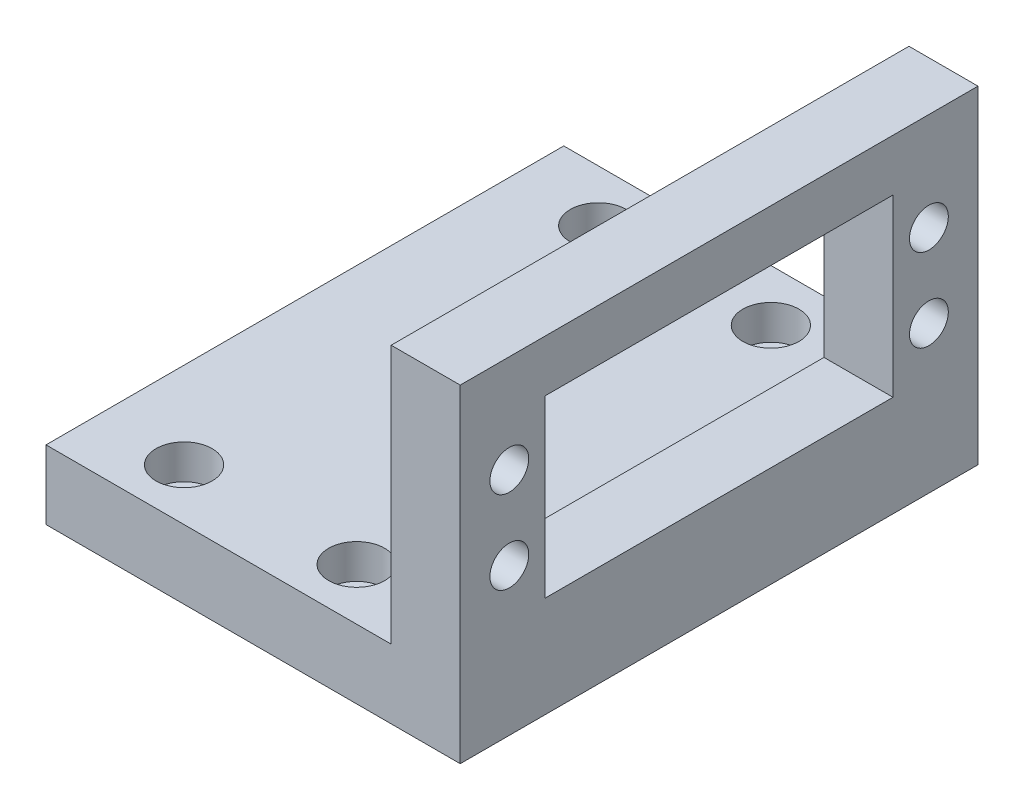
ISO-10303-21;
HEADER;
FILE_DESCRIPTION(('STEP AP214'),'2;1');
FILE_NAME('part.step','',(''),(''),'','','');
FILE_SCHEMA(('AUTOMOTIVE_DESIGN { 1 0 10303 214 1 1 1 1 }'));
ENDSEC;
DATA;
#1=APPLICATION_CONTEXT('core data for automotive mechanical design processes');
#2=APPLICATION_PROTOCOL_DEFINITION('international standard','automotive_design',2000,#1);
#3=PRODUCT_CONTEXT('',#1,'mechanical');
#4=PRODUCT('Part','Part','',(#3));
#5=PRODUCT_RELATED_PRODUCT_CATEGORY('part','',(#4));
#6=PRODUCT_DEFINITION_FORMATION('','',#4);
#7=PRODUCT_DEFINITION_CONTEXT('part definition',#1,'design');
#8=PRODUCT_DEFINITION('design','',#6,#7);
#9=PRODUCT_DEFINITION_SHAPE('','',#8);
#10=(LENGTH_UNIT() NAMED_UNIT(*) SI_UNIT(.MILLI.,.METRE.));
#11=(NAMED_UNIT(*) PLANE_ANGLE_UNIT() SI_UNIT($,.RADIAN.));
#12=(NAMED_UNIT(*) SI_UNIT($,.STERADIAN.) SOLID_ANGLE_UNIT());
#13=UNCERTAINTY_MEASURE_WITH_UNIT(LENGTH_MEASURE(1.E-05),#10,'distance_accuracy_value','');
#14=(GEOMETRIC_REPRESENTATION_CONTEXT(3) GLOBAL_UNCERTAINTY_ASSIGNED_CONTEXT((#13)) GLOBAL_UNIT_ASSIGNED_CONTEXT((#10,
#11,#12)) REPRESENTATION_CONTEXT('',''));
#15=CARTESIAN_POINT('',(0.,0.,0.));
#16=DIRECTION('',(0.,0.,1.));
#17=DIRECTION('',(1.,0.,0.));
#18=AXIS2_PLACEMENT_3D('',#15,#16,#17);
#19=CARTESIAN_POINT('',(0.,0.,30.));
#20=DIRECTION('',(0.,-1.,0.));
#21=DIRECTION('',(1.,0.,0.));
#22=AXIS2_PLACEMENT_3D('',#19,#20,#21);
#23=PLANE('',#22);
#24=CARTESIAN_POINT('',(-30.,0.,24.));
#25=DIRECTION('',(0.,1.,0.));
#26=DIRECTION('',(1.,0.,0.));
#27=AXIS2_PLACEMENT_3D('',#24,#25,#26);
#28=CIRCLE('',#27,3.25);
#29=CARTESIAN_POINT('',(-26.75,0.,24.));
#30=VERTEX_POINT('',#29);
#31=EDGE_CURVE('E225',#30,#30,#28,.T.);
#32=ORIENTED_EDGE('',*,*,#31,.F.);
#33=EDGE_LOOP('',(#32));
#34=FACE_BOUND('',#33,.T.);
#35=CARTESIAN_POINT('',(-10.,0.,-24.));
#36=DIRECTION('',(0.,1.,0.));
#37=DIRECTION('',(1.,0.,0.));
#38=AXIS2_PLACEMENT_3D('',#35,#36,#37);
#39=CIRCLE('',#38,3.25);
#40=CARTESIAN_POINT('',(-6.75,0.,-24.));
#41=VERTEX_POINT('',#40);
#42=EDGE_CURVE('E236',#41,#41,#39,.T.);
#43=ORIENTED_EDGE('',*,*,#42,.F.);
#44=EDGE_LOOP('',(#43));
#45=FACE_BOUND('',#44,.T.);
#46=CARTESIAN_POINT('',(-10.,0.,24.));
#47=DIRECTION('',(0.,1.,0.));
#48=DIRECTION('',(-1.,0.,0.));
#49=AXIS2_PLACEMENT_3D('',#46,#47,#48);
#50=CIRCLE('',#49,3.25);
#51=CARTESIAN_POINT('',(-13.25,0.,24.));
#52=VERTEX_POINT('',#51);
#53=EDGE_CURVE('E230',#52,#52,#50,.T.);
#54=ORIENTED_EDGE('',*,*,#53,.F.);
#55=EDGE_LOOP('',(#54));
#56=FACE_BOUND('',#55,.T.);
#57=CARTESIAN_POINT('',(-30.,0.,-24.));
#58=DIRECTION('',(0.,1.,0.));
#59=DIRECTION('',(-1.,0.,0.));
#60=AXIS2_PLACEMENT_3D('',#57,#58,#59);
#61=CIRCLE('',#60,3.25);
#62=CARTESIAN_POINT('',(-33.25,0.,-24.));
#63=VERTEX_POINT('',#62);
#64=EDGE_CURVE('E229',#63,#63,#61,.T.);
#65=ORIENTED_EDGE('',*,*,#64,.F.);
#66=EDGE_LOOP('',(#65));
#67=FACE_BOUND('',#66,.T.);
#68=DIRECTION('',(-1.,0.,0.));
#69=VECTOR('',#68,1.);
#70=CARTESIAN_POINT('',(0.,0.,-30.));
#71=LINE('',#70,#69);
#72=CARTESIAN_POINT('',(0.,0.,-30.));
#73=VERTEX_POINT('',#72);
#74=CARTESIAN_POINT('',(-40.,0.,-30.));
#75=VERTEX_POINT('',#74);
#76=EDGE_CURVE('E137',#73,#75,#71,.T.);
#77=ORIENTED_EDGE('',*,*,#76,.T.);
#78=DIRECTION('',(0.,0.,-1.));
#79=VECTOR('',#78,1.);
#80=CARTESIAN_POINT('',(-40.,0.,30.));
#81=LINE('',#80,#79);
#82=CARTESIAN_POINT('',(-40.,0.,30.));
#83=VERTEX_POINT('',#82);
#84=EDGE_CURVE('E183',#83,#75,#81,.T.);
#85=ORIENTED_EDGE('',*,*,#84,.F.);
#86=DIRECTION('',(-1.,0.,0.));
#87=VECTOR('',#86,1.);
#88=CARTESIAN_POINT('',(0.,0.,30.));
#89=LINE('',#88,#87);
#90=CARTESIAN_POINT('',(0.,0.,30.));
#91=VERTEX_POINT('',#90);
#92=EDGE_CURVE('E140',#91,#83,#89,.T.);
#93=ORIENTED_EDGE('',*,*,#92,.F.);
#94=DIRECTION('',(0.,0.,-1.));
#95=VECTOR('',#94,1.);
#96=CARTESIAN_POINT('',(0.,0.,30.));
#97=LINE('',#96,#95);
#98=EDGE_CURVE('E157',#91,#73,#97,.T.);
#99=ORIENTED_EDGE('',*,*,#98,.T.);
#100=EDGE_LOOP('',(#77,#85,#93,#99));
#101=FACE_BOUND('',#100,.T.);
#102=ADVANCED_FACE('F34',(#34,#45,#56,#67,#101),#23,.F.);
#103=CARTESIAN_POINT('',(-40.,0.,30.));
#104=DIRECTION('',(1.,0.,0.));
#105=DIRECTION('',(0.,0.,-1.));
#106=AXIS2_PLACEMENT_3D('',#103,#104,#105);
#107=PLANE('',#106);
#108=DIRECTION('',(0.,-1.,0.));
#109=VECTOR('',#108,1.);
#110=CARTESIAN_POINT('',(-40.,0.,-30.));
#111=LINE('',#110,#109);
#112=CARTESIAN_POINT('',(-40.,-7.99999999999999,-30.));
#113=VERTEX_POINT('',#112);
#114=EDGE_CURVE('E160',#75,#113,#111,.T.);
#115=ORIENTED_EDGE('',*,*,#114,.T.);
#116=DIRECTION('',(0.,0.,-1.));
#117=VECTOR('',#116,1.);
#118=CARTESIAN_POINT('',(-40.,-7.99999999999999,30.));
#119=LINE('',#118,#117);
#120=CARTESIAN_POINT('',(-40.,-7.99999999999999,30.));
#121=VERTEX_POINT('',#120);
#122=EDGE_CURVE('E181',#121,#113,#119,.T.);
#123=ORIENTED_EDGE('',*,*,#122,.F.);
#124=DIRECTION('',(0.,-1.,0.));
#125=VECTOR('',#124,1.);
#126=CARTESIAN_POINT('',(-40.,0.,30.));
#127=LINE('',#126,#125);
#128=EDGE_CURVE('E143',#83,#121,#127,.T.);
#129=ORIENTED_EDGE('',*,*,#128,.F.);
#130=ORIENTED_EDGE('',*,*,#84,.T.);
#131=EDGE_LOOP('',(#115,#123,#129,#130));
#132=FACE_BOUND('',#131,.T.);
#133=ADVANCED_FACE('F289',(#132),#107,.F.);
#134=CARTESIAN_POINT('',(0.,-8.,30.));
#135=DIRECTION('',(0.,-1.,0.));
#136=DIRECTION('',(1.,0.,0.));
#137=AXIS2_PLACEMENT_3D('',#134,#135,#136);
#138=PLANE('',#137);
#139=CARTESIAN_POINT('',(-30.,-7.99999999999999,-24.));
#140=DIRECTION('',(0.,-1.,0.));
#141=DIRECTION('',(1.,0.,0.));
#142=AXIS2_PLACEMENT_3D('',#139,#140,#141);
#143=CIRCLE('',#142,1.7);
#144=CARTESIAN_POINT('',(-28.3,-7.99999999999999,-24.));
#145=VERTEX_POINT('',#144);
#146=EDGE_CURVE('E37',#145,#145,#143,.T.);
#147=ORIENTED_EDGE('',*,*,#146,.F.);
#148=EDGE_LOOP('',(#147));
#149=FACE_BOUND('',#148,.T.);
#150=CARTESIAN_POINT('',(-10.,-8.,-24.));
#151=DIRECTION('',(0.,-1.,0.));
#152=DIRECTION('',(1.,0.,0.));
#153=AXIS2_PLACEMENT_3D('',#150,#151,#152);
#154=CIRCLE('',#153,1.7);
#155=CARTESIAN_POINT('',(-8.3,-8.,-24.));
#156=VERTEX_POINT('',#155);
#157=EDGE_CURVE('E205',#156,#156,#154,.T.);
#158=ORIENTED_EDGE('',*,*,#157,.F.);
#159=EDGE_LOOP('',(#158));
#160=FACE_BOUND('',#159,.T.);
#161=CARTESIAN_POINT('',(-10.,-8.,24.));
#162=DIRECTION('',(0.,-1.,0.));
#163=DIRECTION('',(1.,0.,0.));
#164=AXIS2_PLACEMENT_3D('',#161,#162,#163);
#165=CIRCLE('',#164,1.7);
#166=CARTESIAN_POINT('',(-8.3,-8.,24.));
#167=VERTEX_POINT('',#166);
#168=EDGE_CURVE('E204',#167,#167,#165,.T.);
#169=ORIENTED_EDGE('',*,*,#168,.F.);
#170=EDGE_LOOP('',(#169));
#171=FACE_BOUND('',#170,.T.);
#172=CARTESIAN_POINT('',(-30.,-7.99999999999999,24.));
#173=DIRECTION('',(0.,-1.,0.));
#174=DIRECTION('',(1.,0.,0.));
#175=AXIS2_PLACEMENT_3D('',#172,#173,#174);
#176=CIRCLE('',#175,1.7);
#177=CARTESIAN_POINT('',(-28.3,-7.99999999999999,24.));
#178=VERTEX_POINT('',#177);
#179=EDGE_CURVE('E222',#178,#178,#176,.T.);
#180=ORIENTED_EDGE('',*,*,#179,.F.);
#181=EDGE_LOOP('',(#180));
#182=FACE_BOUND('',#181,.T.);
#183=DIRECTION('',(-1.,0.,0.));
#184=VECTOR('',#183,1.);
#185=CARTESIAN_POINT('',(0.,-8.,-30.));
#186=LINE('',#185,#184);
#187=CARTESIAN_POINT('',(7.99999999999999,-8.,-30.));
#188=VERTEX_POINT('',#187);
#189=EDGE_CURVE('E163',#188,#113,#186,.T.);
#190=ORIENTED_EDGE('',*,*,#189,.F.);
#191=DIRECTION('',(0.,0.,-1.));
#192=VECTOR('',#191,1.);
#193=CARTESIAN_POINT('',(7.99999999999999,-8.,30.));
#194=LINE('',#193,#192);
#195=CARTESIAN_POINT('',(7.99999999999999,-8.,30.));
#196=VERTEX_POINT('',#195);
#197=EDGE_CURVE('E179',#196,#188,#194,.T.);
#198=ORIENTED_EDGE('',*,*,#197,.F.);
#199=DIRECTION('',(-1.,0.,0.));
#200=VECTOR('',#199,1.);
#201=CARTESIAN_POINT('',(0.,-8.,30.));
#202=LINE('',#201,#200);
#203=EDGE_CURVE('E146',#196,#121,#202,.T.);
#204=ORIENTED_EDGE('',*,*,#203,.T.);
#205=ORIENTED_EDGE('',*,*,#122,.T.);
#206=EDGE_LOOP('',(#190,#198,#204,#205));
#207=FACE_BOUND('',#206,.T.);
#208=ADVANCED_FACE('F266',(#149,#160,#171,#182,#207),#138,.T.);
#209=CARTESIAN_POINT('',(7.99999999999999,0.,30.));
#210=DIRECTION('',(-1.,0.,0.));
#211=DIRECTION('',(0.,-1.,0.));
#212=AXIS2_PLACEMENT_3D('',#209,#210,#211);
#213=PLANE('',#212);
#214=CARTESIAN_POINT('',(7.99999999999999,18.65,-24.31));
#215=DIRECTION('',(1.,0.,0.));
#216=DIRECTION('',(0.,-1.,0.));
#217=AXIS2_PLACEMENT_3D('',#214,#215,#216);
#218=CIRCLE('',#217,2.25);
#219=CARTESIAN_POINT('',(7.99999999999999,16.4,-24.31));
#220=VERTEX_POINT('',#219);
#221=EDGE_CURVE('E247',#220,#220,#218,.T.);
#222=ORIENTED_EDGE('',*,*,#221,.F.);
#223=EDGE_LOOP('',(#222));
#224=FACE_BOUND('',#223,.T.);
#225=CARTESIAN_POINT('',(7.99999999999999,9.05,-24.31));
#226=DIRECTION('',(1.,0.,0.));
#227=DIRECTION('',(0.,1.,0.));
#228=AXIS2_PLACEMENT_3D('',#225,#226,#227);
#229=CIRCLE('',#228,2.25);
#230=CARTESIAN_POINT('',(7.99999999999999,11.3,-24.31));
#231=VERTEX_POINT('',#230);
#232=EDGE_CURVE('E255',#231,#231,#229,.T.);
#233=ORIENTED_EDGE('',*,*,#232,.F.);
#234=EDGE_LOOP('',(#233));
#235=FACE_BOUND('',#234,.T.);
#236=CARTESIAN_POINT('',(7.99999999999999,9.05,24.31));
#237=DIRECTION('',(1.,0.,0.));
#238=DIRECTION('',(0.,-1.,0.));
#239=AXIS2_PLACEMENT_3D('',#236,#237,#238);
#240=CIRCLE('',#239,2.25);
#241=CARTESIAN_POINT('',(7.99999999999999,6.8,24.31));
#242=VERTEX_POINT('',#241);
#243=EDGE_CURVE('E252',#242,#242,#240,.T.);
#244=ORIENTED_EDGE('',*,*,#243,.F.);
#245=EDGE_LOOP('',(#244));
#246=FACE_BOUND('',#245,.T.);
#247=CARTESIAN_POINT('',(7.99999999999999,18.65,24.31));
#248=DIRECTION('',(1.,0.,0.));
#249=DIRECTION('',(0.,1.,0.));
#250=AXIS2_PLACEMENT_3D('',#247,#248,#249);
#251=CIRCLE('',#250,2.25);
#252=CARTESIAN_POINT('',(7.99999999999999,20.9,24.31));
#253=VERTEX_POINT('',#252);
#254=EDGE_CURVE('E194',#253,#253,#251,.T.);
#255=ORIENTED_EDGE('',*,*,#254,.F.);
#256=EDGE_LOOP('',(#255));
#257=FACE_BOUND('',#256,.T.);
#258=DIRECTION('',(0.,0.,-1.));
#259=VECTOR('',#258,1.);
#260=CARTESIAN_POINT('',(7.99999999999999,3.7,20.15));
#261=LINE('',#260,#259);
#262=CARTESIAN_POINT('',(7.99999999999999,3.7,20.15));
#263=VERTEX_POINT('',#262);
#264=CARTESIAN_POINT('',(7.99999999999999,3.7,-20.15));
#265=VERTEX_POINT('',#264);
#266=EDGE_CURVE('E123',#263,#265,#261,.T.);
#267=ORIENTED_EDGE('',*,*,#266,.F.);
#268=DIRECTION('',(0.,-1.,0.));
#269=VECTOR('',#268,1.);
#270=CARTESIAN_POINT('',(7.99999999999999,24.,20.15));
#271=LINE('',#270,#269);
#272=CARTESIAN_POINT('',(7.99999999999999,24.,20.15));
#273=VERTEX_POINT('',#272);
#274=EDGE_CURVE('E50',#273,#263,#271,.T.);
#275=ORIENTED_EDGE('',*,*,#274,.F.);
#276=DIRECTION('',(0.,0.,1.));
#277=VECTOR('',#276,1.);
#278=CARTESIAN_POINT('',(7.99999999999999,24.,20.15));
#279=LINE('',#278,#277);
#280=CARTESIAN_POINT('',(7.99999999999999,24.,-20.15));
#281=VERTEX_POINT('',#280);
#282=EDGE_CURVE('E130',#281,#273,#279,.T.);
#283=ORIENTED_EDGE('',*,*,#282,.F.);
#284=DIRECTION('',(0.,1.,0.));
#285=VECTOR('',#284,1.);
#286=CARTESIAN_POINT('',(7.99999999999999,24.,-20.15));
#287=LINE('',#286,#285);
#288=EDGE_CURVE('E114',#265,#281,#287,.T.);
#289=ORIENTED_EDGE('',*,*,#288,.F.);
#290=EDGE_LOOP('',(#267,#275,#283,#289));
#291=FACE_BOUND('',#290,.T.);
#292=DIRECTION('',(0.,1.,0.));
#293=VECTOR('',#292,1.);
#294=CARTESIAN_POINT('',(7.99999999999999,0.,-30.));
#295=LINE('',#294,#293);
#296=CARTESIAN_POINT('',(7.99999999999999,30.,-30.));
#297=VERTEX_POINT('',#296);
#298=EDGE_CURVE('E166',#188,#297,#295,.T.);
#299=ORIENTED_EDGE('',*,*,#298,.T.);
#300=DIRECTION('',(0.,0.,-1.));
#301=VECTOR('',#300,1.);
#302=CARTESIAN_POINT('',(7.99999999999999,30.,30.));
#303=LINE('',#302,#301);
#304=CARTESIAN_POINT('',(7.99999999999999,30.,30.));
#305=VERTEX_POINT('',#304);
#306=EDGE_CURVE('E177',#305,#297,#303,.T.);
#307=ORIENTED_EDGE('',*,*,#306,.F.);
#308=DIRECTION('',(0.,1.,0.));
#309=VECTOR('',#308,1.);
#310=CARTESIAN_POINT('',(7.99999999999999,0.,30.));
#311=LINE('',#310,#309);
#312=EDGE_CURVE('E149',#196,#305,#311,.T.);
#313=ORIENTED_EDGE('',*,*,#312,.F.);
#314=ORIENTED_EDGE('',*,*,#197,.T.);
#315=EDGE_LOOP('',(#299,#307,#313,#314));
#316=FACE_BOUND('',#315,.T.);
#317=ADVANCED_FACE('F127',(#224,#235,#246,#257,#291,#316),#213,.F.);
#318=CARTESIAN_POINT('',(0.,30.,30.));
#319=DIRECTION('',(0.,1.,0.));
#320=DIRECTION('',(-1.,0.,0.));
#321=AXIS2_PLACEMENT_3D('',#318,#319,#320);
#322=PLANE('',#321);
#323=DIRECTION('',(1.,0.,0.));
#324=VECTOR('',#323,1.);
#325=CARTESIAN_POINT('',(0.,30.,-30.));
#326=LINE('',#325,#324);
#327=CARTESIAN_POINT('',(0.,30.,-30.));
#328=VERTEX_POINT('',#327);
#329=EDGE_CURVE('E169',#328,#297,#326,.T.);
#330=ORIENTED_EDGE('',*,*,#329,.F.);
#331=DIRECTION('',(0.,0.,-1.));
#332=VECTOR('',#331,1.);
#333=CARTESIAN_POINT('',(0.,30.,30.));
#334=LINE('',#333,#332);
#335=CARTESIAN_POINT('',(0.,30.,30.));
#336=VERTEX_POINT('',#335);
#337=EDGE_CURVE('E175',#336,#328,#334,.T.);
#338=ORIENTED_EDGE('',*,*,#337,.F.);
#339=DIRECTION('',(1.,0.,0.));
#340=VECTOR('',#339,1.);
#341=CARTESIAN_POINT('',(0.,30.,30.));
#342=LINE('',#341,#340);
#343=EDGE_CURVE('E151',#336,#305,#342,.T.);
#344=ORIENTED_EDGE('',*,*,#343,.T.);
#345=ORIENTED_EDGE('',*,*,#306,.T.);
#346=EDGE_LOOP('',(#330,#338,#344,#345));
#347=FACE_BOUND('',#346,.T.);
#348=ADVANCED_FACE('F265',(#347),#322,.T.);
#349=CARTESIAN_POINT('',(0.,0.,30.));
#350=DIRECTION('',(-1.,0.,0.));
#351=DIRECTION('',(0.,-1.,0.));
#352=AXIS2_PLACEMENT_3D('',#349,#350,#351);
#353=PLANE('',#352);
#354=CARTESIAN_POINT('',(0.,18.65,-24.31));
#355=DIRECTION('',(-1.,0.,0.));
#356=DIRECTION('',(0.,-1.,0.));
#357=AXIS2_PLACEMENT_3D('',#354,#355,#356);
#358=CIRCLE('',#357,2.25);
#359=CARTESIAN_POINT('',(0.,16.4,-24.31));
#360=VERTEX_POINT('',#359);
#361=EDGE_CURVE('E200',#360,#360,#358,.T.);
#362=ORIENTED_EDGE('',*,*,#361,.F.);
#363=EDGE_LOOP('',(#362));
#364=FACE_BOUND('',#363,.T.);
#365=CARTESIAN_POINT('',(0.,9.05,-24.31));
#366=DIRECTION('',(-1.,0.,0.));
#367=DIRECTION('',(0.,-1.,0.));
#368=AXIS2_PLACEMENT_3D('',#365,#366,#367);
#369=CIRCLE('',#368,2.25);
#370=CARTESIAN_POINT('',(0.,6.8,-24.31));
#371=VERTEX_POINT('',#370);
#372=EDGE_CURVE('E197',#371,#371,#369,.T.);
#373=ORIENTED_EDGE('',*,*,#372,.F.);
#374=EDGE_LOOP('',(#373));
#375=FACE_BOUND('',#374,.T.);
#376=CARTESIAN_POINT('',(0.,9.05,24.31));
#377=DIRECTION('',(-1.,0.,0.));
#378=DIRECTION('',(0.,-1.,0.));
#379=AXIS2_PLACEMENT_3D('',#376,#377,#378);
#380=CIRCLE('',#379,2.25);
#381=CARTESIAN_POINT('',(0.,6.8,24.31));
#382=VERTEX_POINT('',#381);
#383=EDGE_CURVE('E193',#382,#382,#380,.T.);
#384=ORIENTED_EDGE('',*,*,#383,.F.);
#385=EDGE_LOOP('',(#384));
#386=FACE_BOUND('',#385,.T.);
#387=CARTESIAN_POINT('',(0.,18.65,24.31));
#388=DIRECTION('',(-1.,0.,0.));
#389=DIRECTION('',(0.,-1.,0.));
#390=AXIS2_PLACEMENT_3D('',#387,#388,#389);
#391=CIRCLE('',#390,2.25);
#392=CARTESIAN_POINT('',(0.,16.4,24.31));
#393=VERTEX_POINT('',#392);
#394=EDGE_CURVE('E190',#393,#393,#391,.T.);
#395=ORIENTED_EDGE('',*,*,#394,.F.);
#396=EDGE_LOOP('',(#395));
#397=FACE_BOUND('',#396,.T.);
#398=DIRECTION('',(0.,1.,0.));
#399=VECTOR('',#398,1.);
#400=CARTESIAN_POINT('',(0.,0.,20.15));
#401=LINE('',#400,#399);
#402=CARTESIAN_POINT('',(0.,3.7,20.15));
#403=VERTEX_POINT('',#402);
#404=CARTESIAN_POINT('',(0.,24.,20.15));
#405=VERTEX_POINT('',#404);
#406=EDGE_CURVE('E11',#403,#405,#401,.T.);
#407=ORIENTED_EDGE('',*,*,#406,.F.);
#408=DIRECTION('',(0.,0.,1.));
#409=VECTOR('',#408,1.);
#410=CARTESIAN_POINT('',(0.,3.7,30.));
#411=LINE('',#410,#409);
#412=CARTESIAN_POINT('',(0.,3.7,-20.15));
#413=VERTEX_POINT('',#412);
#414=EDGE_CURVE('E186',#413,#403,#411,.T.);
#415=ORIENTED_EDGE('',*,*,#414,.F.);
#416=DIRECTION('',(0.,-1.,0.));
#417=VECTOR('',#416,1.);
#418=CARTESIAN_POINT('',(0.,0.,-20.15));
#419=LINE('',#418,#417);
#420=CARTESIAN_POINT('',(0.,24.,-20.15));
#421=VERTEX_POINT('',#420);
#422=EDGE_CURVE('E117',#421,#413,#419,.T.);
#423=ORIENTED_EDGE('',*,*,#422,.F.);
#424=DIRECTION('',(0.,0.,-1.));
#425=VECTOR('',#424,1.);
#426=CARTESIAN_POINT('',(0.,24.,30.));
#427=LINE('',#426,#425);
#428=EDGE_CURVE('E42',#405,#421,#427,.T.);
#429=ORIENTED_EDGE('',*,*,#428,.F.);
#430=EDGE_LOOP('',(#407,#415,#423,#429));
#431=FACE_BOUND('',#430,.T.);
#432=DIRECTION('',(0.,1.,0.));
#433=VECTOR('',#432,1.);
#434=CARTESIAN_POINT('',(0.,0.,-30.));
#435=LINE('',#434,#433);
#436=EDGE_CURVE('E144',#73,#328,#435,.T.);
#437=ORIENTED_EDGE('',*,*,#436,.F.);
#438=ORIENTED_EDGE('',*,*,#98,.F.);
#439=DIRECTION('',(0.,1.,0.));
#440=VECTOR('',#439,1.);
#441=CARTESIAN_POINT('',(0.,0.,30.));
#442=LINE('',#441,#440);
#443=EDGE_CURVE('E154',#91,#336,#442,.T.);
#444=ORIENTED_EDGE('',*,*,#443,.T.);
#445=ORIENTED_EDGE('',*,*,#337,.T.);
#446=EDGE_LOOP('',(#437,#438,#444,#445));
#447=FACE_BOUND('',#446,.T.);
#448=ADVANCED_FACE('F312',(#364,#375,#386,#397,#431,#447),#353,.T.);
#449=CARTESIAN_POINT('',(0.,0.,30.));
#450=DIRECTION('',(0.,0.,1.));
#451=DIRECTION('',(1.,0.,0.));
#452=AXIS2_PLACEMENT_3D('',#449,#450,#451);
#453=PLANE('',#452);
#454=ORIENTED_EDGE('',*,*,#92,.T.);
#455=ORIENTED_EDGE('',*,*,#128,.T.);
#456=ORIENTED_EDGE('',*,*,#203,.F.);
#457=ORIENTED_EDGE('',*,*,#312,.T.);
#458=ORIENTED_EDGE('',*,*,#343,.F.);
#459=ORIENTED_EDGE('',*,*,#443,.F.);
#460=EDGE_LOOP('',(#454,#455,#456,#457,#458,#459));
#461=FACE_BOUND('',#460,.T.);
#462=ADVANCED_FACE('F325',(#461),#453,.T.);
#463=CARTESIAN_POINT('',(0.,0.,-30.));
#464=DIRECTION('',(0.,0.,1.));
#465=DIRECTION('',(1.,0.,0.));
#466=AXIS2_PLACEMENT_3D('',#463,#464,#465);
#467=PLANE('',#466);
#468=ORIENTED_EDGE('',*,*,#76,.F.);
#469=ORIENTED_EDGE('',*,*,#436,.T.);
#470=ORIENTED_EDGE('',*,*,#329,.T.);
#471=ORIENTED_EDGE('',*,*,#298,.F.);
#472=ORIENTED_EDGE('',*,*,#189,.T.);
#473=ORIENTED_EDGE('',*,*,#114,.F.);
#474=EDGE_LOOP('',(#468,#469,#470,#471,#472,#473));
#475=FACE_BOUND('',#474,.T.);
#476=ADVANCED_FACE('F310',(#475),#467,.F.);
#477=CARTESIAN_POINT('',(-52.,24.,20.15));
#478=DIRECTION('',(0.,0.,1.));
#479=DIRECTION('',(0.,-1.,0.));
#480=AXIS2_PLACEMENT_3D('',#477,#478,#479);
#481=PLANE('',#480);
#482=ORIENTED_EDGE('',*,*,#406,.T.);
#483=DIRECTION('',(1.,0.,0.));
#484=VECTOR('',#483,1.);
#485=CARTESIAN_POINT('',(-52.,24.,20.15));
#486=LINE('',#485,#484);
#487=EDGE_CURVE('E135',#405,#273,#486,.T.);
#488=ORIENTED_EDGE('',*,*,#487,.T.);
#489=ORIENTED_EDGE('',*,*,#274,.T.);
#490=DIRECTION('',(1.,0.,0.));
#491=VECTOR('',#490,1.);
#492=CARTESIAN_POINT('',(-52.,3.69999999999999,20.15));
#493=LINE('',#492,#491);
#494=EDGE_CURVE('E120',#403,#263,#493,.T.);
#495=ORIENTED_EDGE('',*,*,#494,.F.);
#496=EDGE_LOOP('',(#482,#488,#489,#495));
#497=FACE_BOUND('',#496,.T.);
#498=ADVANCED_FACE('F332',(#497),#481,.F.);
#499=CARTESIAN_POINT('',(-52.,24.,20.15));
#500=DIRECTION('',(0.,1.,0.));
#501=DIRECTION('',(-1.,0.,0.));
#502=AXIS2_PLACEMENT_3D('',#499,#500,#501);
#503=PLANE('',#502);
#504=ORIENTED_EDGE('',*,*,#428,.T.);
#505=DIRECTION('',(1.,0.,0.));
#506=VECTOR('',#505,1.);
#507=CARTESIAN_POINT('',(-52.,24.,-20.15));
#508=LINE('',#507,#506);
#509=EDGE_CURVE('E119',#421,#281,#508,.T.);
#510=ORIENTED_EDGE('',*,*,#509,.T.);
#511=ORIENTED_EDGE('',*,*,#282,.T.);
#512=ORIENTED_EDGE('',*,*,#487,.F.);
#513=EDGE_LOOP('',(#504,#510,#511,#512));
#514=FACE_BOUND('',#513,.T.);
#515=ADVANCED_FACE('F398',(#514),#503,.F.);
#516=CARTESIAN_POINT('',(-52.,24.,-20.15));
#517=DIRECTION('',(0.,0.,-1.));
#518=DIRECTION('',(0.,1.,0.));
#519=AXIS2_PLACEMENT_3D('',#516,#517,#518);
#520=PLANE('',#519);
#521=ORIENTED_EDGE('',*,*,#422,.T.);
#522=DIRECTION('',(1.,0.,0.));
#523=VECTOR('',#522,1.);
#524=CARTESIAN_POINT('',(-52.,3.69999999999999,-20.15));
#525=LINE('',#524,#523);
#526=EDGE_CURVE('E58',#413,#265,#525,.T.);
#527=ORIENTED_EDGE('',*,*,#526,.T.);
#528=ORIENTED_EDGE('',*,*,#288,.T.);
#529=ORIENTED_EDGE('',*,*,#509,.F.);
#530=EDGE_LOOP('',(#521,#527,#528,#529));
#531=FACE_BOUND('',#530,.T.);
#532=ADVANCED_FACE('F111',(#531),#520,.F.);
#533=CARTESIAN_POINT('',(-52.,3.69999999999999,20.15));
#534=DIRECTION('',(0.,-1.,0.));
#535=DIRECTION('',(1.,0.,0.));
#536=AXIS2_PLACEMENT_3D('',#533,#534,#535);
#537=PLANE('',#536);
#538=ORIENTED_EDGE('',*,*,#414,.T.);
#539=ORIENTED_EDGE('',*,*,#494,.T.);
#540=ORIENTED_EDGE('',*,*,#266,.T.);
#541=ORIENTED_EDGE('',*,*,#526,.F.);
#542=EDGE_LOOP('',(#538,#539,#540,#541));
#543=FACE_BOUND('',#542,.T.);
#544=ADVANCED_FACE('F124',(#543),#537,.F.);
#545=CARTESIAN_POINT('',(-52.,18.65,24.31));
#546=DIRECTION('',(1.,0.,0.));
#547=DIRECTION('',(0.,1.,0.));
#548=AXIS2_PLACEMENT_3D('',#545,#546,#547);
#549=CYLINDRICAL_SURFACE('',#548,2.25);
#550=ORIENTED_EDGE('',*,*,#394,.T.);
#551=EDGE_LOOP('',(#550));
#552=FACE_BOUND('',#551,.T.);
#553=ORIENTED_EDGE('',*,*,#254,.T.);
#554=EDGE_LOOP('',(#553));
#555=FACE_BOUND('',#554,.T.);
#556=ADVANCED_FACE('F274',(#552,#555),#549,.F.);
#557=CARTESIAN_POINT('',(-52.,9.04999999999999,24.31));
#558=DIRECTION('',(1.,0.,0.));
#559=DIRECTION('',(0.,1.,0.));
#560=AXIS2_PLACEMENT_3D('',#557,#558,#559);
#561=CYLINDRICAL_SURFACE('',#560,2.25);
#562=ORIENTED_EDGE('',*,*,#383,.T.);
#563=EDGE_LOOP('',(#562));
#564=FACE_BOUND('',#563,.T.);
#565=ORIENTED_EDGE('',*,*,#243,.T.);
#566=EDGE_LOOP('',(#565));
#567=FACE_BOUND('',#566,.T.);
#568=ADVANCED_FACE('F276',(#564,#567),#561,.F.);
#569=CARTESIAN_POINT('',(-52.,9.04999999999999,-24.31));
#570=DIRECTION('',(1.,0.,0.));
#571=DIRECTION('',(0.,1.,0.));
#572=AXIS2_PLACEMENT_3D('',#569,#570,#571);
#573=CYLINDRICAL_SURFACE('',#572,2.25);
#574=ORIENTED_EDGE('',*,*,#372,.T.);
#575=EDGE_LOOP('',(#574));
#576=FACE_BOUND('',#575,.T.);
#577=ORIENTED_EDGE('',*,*,#232,.T.);
#578=EDGE_LOOP('',(#577));
#579=FACE_BOUND('',#578,.T.);
#580=ADVANCED_FACE('F283',(#576,#579),#573,.F.);
#581=CARTESIAN_POINT('',(-52.,18.65,-24.31));
#582=DIRECTION('',(1.,0.,0.));
#583=DIRECTION('',(0.,1.,0.));
#584=AXIS2_PLACEMENT_3D('',#581,#582,#583);
#585=CYLINDRICAL_SURFACE('',#584,2.25);
#586=ORIENTED_EDGE('',*,*,#361,.T.);
#587=EDGE_LOOP('',(#586));
#588=FACE_BOUND('',#587,.T.);
#589=ORIENTED_EDGE('',*,*,#221,.T.);
#590=EDGE_LOOP('',(#589));
#591=FACE_BOUND('',#590,.T.);
#592=ADVANCED_FACE('F261',(#588,#591),#585,.F.);
#593=CARTESIAN_POINT('',(-30.,-4.00000000000001,-24.));
#594=DIRECTION('',(0.,1.,0.));
#595=DIRECTION('',(-1.,0.,0.));
#596=AXIS2_PLACEMENT_3D('',#593,#594,#595);
#597=CYLINDRICAL_SURFACE('',#596,3.25);
#598=CARTESIAN_POINT('',(-30.,-4.00000000000001,-24.));
#599=DIRECTION('',(0.,1.,0.));
#600=DIRECTION('',(-1.,0.,0.));
#601=AXIS2_PLACEMENT_3D('',#598,#599,#600);
#602=CIRCLE('',#601,3.25);
#603=CARTESIAN_POINT('',(-33.25,-4.00000000000001,-24.));
#604=VERTEX_POINT('',#603);
#605=EDGE_CURVE('E244',#604,#604,#602,.T.);
#606=ORIENTED_EDGE('',*,*,#605,.F.);
#607=EDGE_LOOP('',(#606));
#608=FACE_BOUND('',#607,.T.);
#609=ORIENTED_EDGE('',*,*,#64,.T.);
#610=EDGE_LOOP('',(#609));
#611=FACE_BOUND('',#610,.T.);
#612=ADVANCED_FACE('F382',(#608,#611),#597,.F.);
#613=CARTESIAN_POINT('',(-30.,-4.00000000000001,-24.));
#614=DIRECTION('',(0.,1.,0.));
#615=DIRECTION('',(-1.,0.,0.));
#616=AXIS2_PLACEMENT_3D('',#613,#614,#615);
#617=PLANE('',#616);
#618=CARTESIAN_POINT('',(-30.,-4.00000000000001,-24.));
#619=DIRECTION('',(0.,1.,0.));
#620=DIRECTION('',(0.,0.,1.));
#621=AXIS2_PLACEMENT_3D('',#618,#619,#620);
#622=CIRCLE('',#621,1.7);
#623=CARTESIAN_POINT('',(-30.,-4.00000000000001,-22.3));
#624=VERTEX_POINT('',#623);
#625=EDGE_CURVE('E536',#624,#624,#622,.T.);
#626=ORIENTED_EDGE('',*,*,#625,.F.);
#627=EDGE_LOOP('',(#626));
#628=FACE_BOUND('',#627,.T.);
#629=ORIENTED_EDGE('',*,*,#605,.T.);
#630=EDGE_LOOP('',(#629));
#631=FACE_BOUND('',#630,.T.);
#632=ADVANCED_FACE('F379',(#628,#631),#617,.T.);
#633=CARTESIAN_POINT('',(-10.,-4.,24.));
#634=DIRECTION('',(0.,1.,0.));
#635=DIRECTION('',(-1.,0.,0.));
#636=AXIS2_PLACEMENT_3D('',#633,#634,#635);
#637=CYLINDRICAL_SURFACE('',#636,3.25);
#638=CARTESIAN_POINT('',(-10.,-4.,24.));
#639=DIRECTION('',(0.,1.,0.));
#640=DIRECTION('',(-1.,0.,0.));
#641=AXIS2_PLACEMENT_3D('',#638,#639,#640);
#642=CIRCLE('',#641,3.25);
#643=CARTESIAN_POINT('',(-13.25,-4.,24.));
#644=VERTEX_POINT('',#643);
#645=EDGE_CURVE('E226',#644,#644,#642,.T.);
#646=ORIENTED_EDGE('',*,*,#645,.F.);
#647=EDGE_LOOP('',(#646));
#648=FACE_BOUND('',#647,.T.);
#649=ORIENTED_EDGE('',*,*,#53,.T.);
#650=EDGE_LOOP('',(#649));
#651=FACE_BOUND('',#650,.T.);
#652=ADVANCED_FACE('F381',(#648,#651),#637,.F.);
#653=CARTESIAN_POINT('',(-10.,-4.,24.));
#654=DIRECTION('',(0.,1.,0.));
#655=DIRECTION('',(-1.,0.,0.));
#656=AXIS2_PLACEMENT_3D('',#653,#654,#655);
#657=PLANE('',#656);
#658=CARTESIAN_POINT('',(-10.,-4.,24.));
#659=DIRECTION('',(0.,1.,0.));
#660=DIRECTION('',(-1.,0.,0.));
#661=AXIS2_PLACEMENT_3D('',#658,#659,#660);
#662=CIRCLE('',#661,1.7);
#663=CARTESIAN_POINT('',(-11.7,-4.,24.));
#664=VERTEX_POINT('',#663);
#665=EDGE_CURVE('E202',#664,#664,#662,.T.);
#666=ORIENTED_EDGE('',*,*,#665,.F.);
#667=EDGE_LOOP('',(#666));
#668=FACE_BOUND('',#667,.T.);
#669=ORIENTED_EDGE('',*,*,#645,.T.);
#670=EDGE_LOOP('',(#669));
#671=FACE_BOUND('',#670,.T.);
#672=ADVANCED_FACE('F467',(#668,#671),#657,.T.);
#673=CARTESIAN_POINT('',(-10.,-4.,-24.));
#674=DIRECTION('',(0.,1.,0.));
#675=DIRECTION('',(-1.,0.,0.));
#676=AXIS2_PLACEMENT_3D('',#673,#674,#675);
#677=CYLINDRICAL_SURFACE('',#676,3.25);
#678=CARTESIAN_POINT('',(-10.,-4.,-24.));
#679=DIRECTION('',(0.,1.,0.));
#680=DIRECTION('',(1.,0.,0.));
#681=AXIS2_PLACEMENT_3D('',#678,#679,#680);
#682=CIRCLE('',#681,3.25);
#683=CARTESIAN_POINT('',(-6.75,-4.,-24.));
#684=VERTEX_POINT('',#683);
#685=EDGE_CURVE('E233',#684,#684,#682,.T.);
#686=ORIENTED_EDGE('',*,*,#685,.F.);
#687=EDGE_LOOP('',(#686));
#688=FACE_BOUND('',#687,.T.);
#689=ORIENTED_EDGE('',*,*,#42,.T.);
#690=EDGE_LOOP('',(#689));
#691=FACE_BOUND('',#690,.T.);
#692=ADVANCED_FACE('F374',(#688,#691),#677,.F.);
#693=CARTESIAN_POINT('',(-10.,-4.,-24.));
#694=DIRECTION('',(0.,-1.,0.));
#695=DIRECTION('',(1.,0.,0.));
#696=AXIS2_PLACEMENT_3D('',#693,#694,#695);
#697=PLANE('',#696);
#698=CARTESIAN_POINT('',(-10.,-4.,-24.));
#699=DIRECTION('',(0.,1.,0.));
#700=DIRECTION('',(0.,0.,1.));
#701=AXIS2_PLACEMENT_3D('',#698,#699,#700);
#702=CIRCLE('',#701,1.7);
#703=CARTESIAN_POINT('',(-10.,-4.,-22.3));
#704=VERTEX_POINT('',#703);
#705=EDGE_CURVE('E212',#704,#704,#702,.T.);
#706=ORIENTED_EDGE('',*,*,#705,.F.);
#707=EDGE_LOOP('',(#706));
#708=FACE_BOUND('',#707,.T.);
#709=ORIENTED_EDGE('',*,*,#685,.T.);
#710=EDGE_LOOP('',(#709));
#711=FACE_BOUND('',#710,.T.);
#712=ADVANCED_FACE('F370',(#708,#711),#697,.F.);
#713=CARTESIAN_POINT('',(-30.,-4.00000000000001,24.));
#714=DIRECTION('',(0.,1.,0.));
#715=DIRECTION('',(-1.,0.,0.));
#716=AXIS2_PLACEMENT_3D('',#713,#714,#715);
#717=CYLINDRICAL_SURFACE('',#716,3.25);
#718=CARTESIAN_POINT('',(-30.,-4.00000000000001,24.));
#719=DIRECTION('',(0.,1.,0.));
#720=DIRECTION('',(1.,0.,0.));
#721=AXIS2_PLACEMENT_3D('',#718,#719,#720);
#722=CIRCLE('',#721,3.25);
#723=CARTESIAN_POINT('',(-26.75,-4.,24.));
#724=VERTEX_POINT('',#723);
#725=EDGE_CURVE('E239',#724,#724,#722,.T.);
#726=ORIENTED_EDGE('',*,*,#725,.F.);
#727=EDGE_LOOP('',(#726));
#728=FACE_BOUND('',#727,.T.);
#729=ORIENTED_EDGE('',*,*,#31,.T.);
#730=EDGE_LOOP('',(#729));
#731=FACE_BOUND('',#730,.T.);
#732=ADVANCED_FACE('F364',(#728,#731),#717,.F.);
#733=CARTESIAN_POINT('',(-30.,-4.00000000000001,24.));
#734=DIRECTION('',(0.,-1.,0.));
#735=DIRECTION('',(1.,0.,0.));
#736=AXIS2_PLACEMENT_3D('',#733,#734,#735);
#737=PLANE('',#736);
#738=CARTESIAN_POINT('',(-30.,-4.00000000000001,24.));
#739=DIRECTION('',(0.,1.,0.));
#740=DIRECTION('',(0.,0.,1.));
#741=AXIS2_PLACEMENT_3D('',#738,#739,#740);
#742=CIRCLE('',#741,1.7);
#743=CARTESIAN_POINT('',(-30.,-4.00000000000001,25.7));
#744=VERTEX_POINT('',#743);
#745=EDGE_CURVE('E209',#744,#744,#742,.T.);
#746=ORIENTED_EDGE('',*,*,#745,.F.);
#747=EDGE_LOOP('',(#746));
#748=FACE_BOUND('',#747,.T.);
#749=ORIENTED_EDGE('',*,*,#725,.T.);
#750=EDGE_LOOP('',(#749));
#751=FACE_BOUND('',#750,.T.);
#752=ADVANCED_FACE('F358',(#748,#751),#737,.F.);
#753=CARTESIAN_POINT('',(-30.,-4.00000000000001,24.));
#754=DIRECTION('',(0.,1.,0.));
#755=DIRECTION('',(0.,0.,1.));
#756=AXIS2_PLACEMENT_3D('',#753,#754,#755);
#757=CYLINDRICAL_SURFACE('',#756,1.7);
#758=ORIENTED_EDGE('',*,*,#179,.T.);
#759=EDGE_LOOP('',(#758));
#760=FACE_BOUND('',#759,.T.);
#761=ORIENTED_EDGE('',*,*,#745,.T.);
#762=EDGE_LOOP('',(#761));
#763=FACE_BOUND('',#762,.T.);
#764=ADVANCED_FACE('F354',(#760,#763),#757,.F.);
#765=CARTESIAN_POINT('',(-10.,0.,24.));
#766=DIRECTION('',(0.,1.,0.));
#767=DIRECTION('',(0.,0.,1.));
#768=AXIS2_PLACEMENT_3D('',#765,#766,#767);
#769=CYLINDRICAL_SURFACE('',#768,1.7);
#770=ORIENTED_EDGE('',*,*,#168,.T.);
#771=EDGE_LOOP('',(#770));
#772=FACE_BOUND('',#771,.T.);
#773=ORIENTED_EDGE('',*,*,#665,.T.);
#774=EDGE_LOOP('',(#773));
#775=FACE_BOUND('',#774,.T.);
#776=ADVANCED_FACE('F357',(#772,#775),#769,.F.);
#777=CARTESIAN_POINT('',(-10.,-4.,-24.));
#778=DIRECTION('',(0.,1.,0.));
#779=DIRECTION('',(0.,0.,1.));
#780=AXIS2_PLACEMENT_3D('',#777,#778,#779);
#781=CYLINDRICAL_SURFACE('',#780,1.7);
#782=ORIENTED_EDGE('',*,*,#157,.T.);
#783=EDGE_LOOP('',(#782));
#784=FACE_BOUND('',#783,.T.);
#785=ORIENTED_EDGE('',*,*,#705,.T.);
#786=EDGE_LOOP('',(#785));
#787=FACE_BOUND('',#786,.T.);
#788=ADVANCED_FACE('F509',(#784,#787),#781,.F.);
#789=CARTESIAN_POINT('',(-30.,-4.00000000000001,-24.));
#790=DIRECTION('',(0.,1.,0.));
#791=DIRECTION('',(0.,0.,1.));
#792=AXIS2_PLACEMENT_3D('',#789,#790,#791);
#793=CYLINDRICAL_SURFACE('',#792,1.7);
#794=ORIENTED_EDGE('',*,*,#146,.T.);
#795=EDGE_LOOP('',(#794));
#796=FACE_BOUND('',#795,.T.);
#797=ORIENTED_EDGE('',*,*,#625,.T.);
#798=EDGE_LOOP('',(#797));
#799=FACE_BOUND('',#798,.T.);
#800=ADVANCED_FACE('F518',(#796,#799),#793,.F.);
#801=CLOSED_SHELL('',(#102,#133,#208,#317,#348,#448,#462,#476,#498,#515,#532,#544,#556,#568,
#580,#592,#612,#632,#652,#672,#692,#712,#732,#752,#764,#776,#788,#800));
#802=MANIFOLD_SOLID_BREP('B2',#801);
#803=ADVANCED_BREP_SHAPE_REPRESENTATION('',(#18,#802),#14);
#804=SHAPE_DEFINITION_REPRESENTATION(#9,#803);
ENDSEC;
END-ISO-10303-21;
